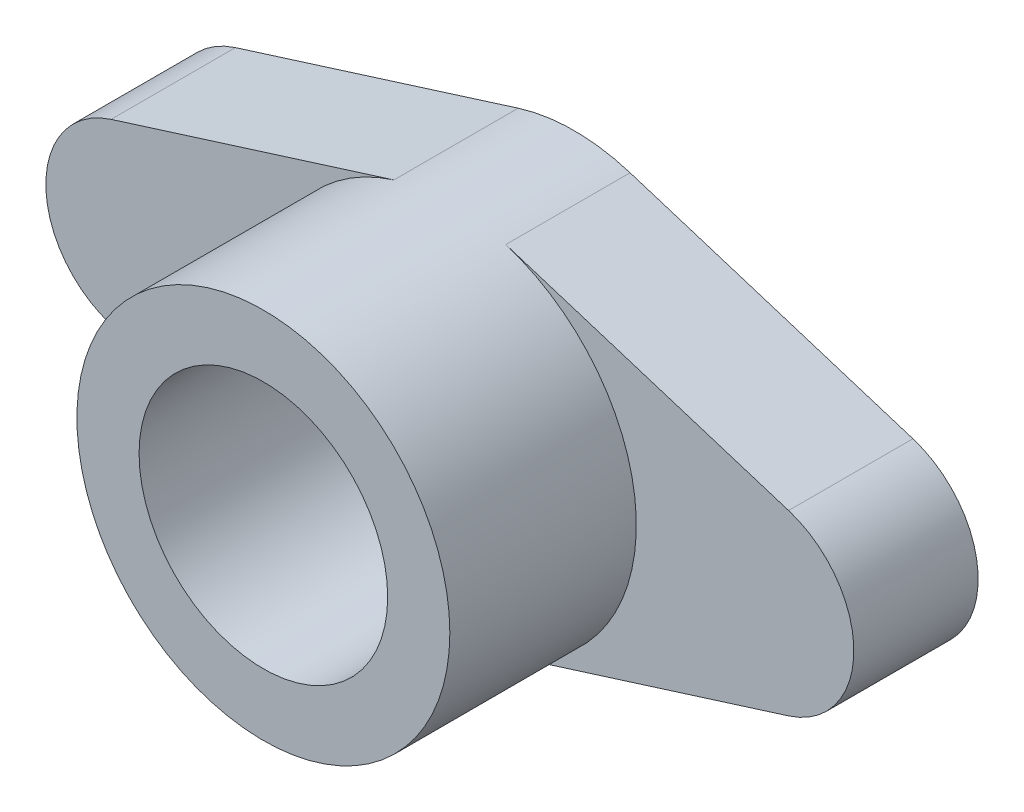
ISO-10303-21;
HEADER;
FILE_DESCRIPTION(('STEP AP214'),'2;1');
FILE_NAME('part.step','',(''),(''),'','','');
FILE_SCHEMA(('AUTOMOTIVE_DESIGN { 1 0 10303 214 1 1 1 1 }'));
ENDSEC;
DATA;
#1=APPLICATION_CONTEXT('core data for automotive mechanical design processes');
#2=APPLICATION_PROTOCOL_DEFINITION('international standard','automotive_design',2000,#1);
#3=PRODUCT_CONTEXT('',#1,'mechanical');
#4=PRODUCT('Part','Part','',(#3));
#5=PRODUCT_RELATED_PRODUCT_CATEGORY('part','',(#4));
#6=PRODUCT_DEFINITION_FORMATION('','',#4);
#7=PRODUCT_DEFINITION_CONTEXT('part definition',#1,'design');
#8=PRODUCT_DEFINITION('design','',#6,#7);
#9=PRODUCT_DEFINITION_SHAPE('','',#8);
#10=(LENGTH_UNIT() NAMED_UNIT(*) SI_UNIT(.MILLI.,.METRE.));
#11=(NAMED_UNIT(*) PLANE_ANGLE_UNIT() SI_UNIT($,.RADIAN.));
#12=(NAMED_UNIT(*) SI_UNIT($,.STERADIAN.) SOLID_ANGLE_UNIT());
#13=UNCERTAINTY_MEASURE_WITH_UNIT(LENGTH_MEASURE(1.E-05),#10,'distance_accuracy_value','');
#14=(GEOMETRIC_REPRESENTATION_CONTEXT(3) GLOBAL_UNCERTAINTY_ASSIGNED_CONTEXT((#13)) GLOBAL_UNIT_ASSIGNED_CONTEXT((#10,
#11,#12)) REPRESENTATION_CONTEXT('',''));
#15=CARTESIAN_POINT('',(0.,0.,0.));
#16=DIRECTION('',(0.,0.,1.));
#17=DIRECTION('',(1.,0.,0.));
#18=AXIS2_PLACEMENT_3D('',#15,#16,#17);
#19=CARTESIAN_POINT('',(50.,0.,20.));
#20=DIRECTION('',(0.,0.,1.));
#21=DIRECTION('',(1.,0.,0.));
#22=AXIS2_PLACEMENT_3D('',#19,#20,#21);
#23=PLANE('',#22);
#24=CARTESIAN_POINT('',(0.,0.,20.));
#25=DIRECTION('',(0.,0.,1.));
#26=DIRECTION('',(1.,0.,0.));
#27=AXIS2_PLACEMENT_3D('',#24,#25,#26);
#28=CIRCLE('',#27,30.);
#29=CARTESIAN_POINT('',(-9.,28.6181760425084,20.));
#30=VERTEX_POINT('',#29);
#31=CARTESIAN_POINT('',(-9.,-28.6181760425084,20.));
#32=VERTEX_POINT('',#31);
#33=EDGE_CURVE('E13',#30,#32,#28,.T.);
#34=ORIENTED_EDGE('',*,*,#33,.F.);
#35=DIRECTION('',(-0.953939201416946,-0.3,0.));
#36=VECTOR('',#35,1.);
#37=CARTESIAN_POINT('',(-9.,28.6181760425084,20.));
#38=LINE('',#37,#36);
#39=CARTESIAN_POINT('',(-54.5,14.3090880212542,20.));
#40=VERTEX_POINT('',#39);
#41=EDGE_CURVE('E151',#30,#40,#38,.T.);
#42=ORIENTED_EDGE('',*,*,#41,.T.);
#43=CARTESIAN_POINT('',(-50.,0.,20.));
#44=DIRECTION('',(0.,0.,1.));
#45=DIRECTION('',(1.,0.,0.));
#46=AXIS2_PLACEMENT_3D('',#43,#44,#45);
#47=CIRCLE('',#46,15.);
#48=CARTESIAN_POINT('',(-54.5,-14.3090880212542,20.));
#49=VERTEX_POINT('',#48);
#50=EDGE_CURVE('E125',#40,#49,#47,.T.);
#51=ORIENTED_EDGE('',*,*,#50,.T.);
#52=DIRECTION('',(0.953939201416946,-0.3,0.));
#53=VECTOR('',#52,1.);
#54=CARTESIAN_POINT('',(-54.5,-14.3090880212542,20.));
#55=LINE('',#54,#53);
#56=EDGE_CURVE('E121',#49,#32,#55,.T.);
#57=ORIENTED_EDGE('',*,*,#56,.T.);
#58=EDGE_LOOP('',(#34,#42,#51,#57));
#59=FACE_BOUND('',#58,.T.);
#60=ADVANCED_FACE('F44',(#59),#23,.T.);
#61=CARTESIAN_POINT('',(8.99999999999999,-28.6181760425084,20.));
#62=VERTEX_POINT('',#61);
#63=CARTESIAN_POINT('',(9.,28.6181760425084,20.));
#64=VERTEX_POINT('',#63);
#65=EDGE_CURVE('E54',#62,#64,#28,.T.);
#66=ORIENTED_EDGE('',*,*,#65,.F.);
#67=DIRECTION('',(0.953939201416946,0.3,0.));
#68=VECTOR('',#67,1.);
#69=CARTESIAN_POINT('',(8.99999999999998,-28.6181760425083,20.));
#70=LINE('',#69,#68);
#71=CARTESIAN_POINT('',(54.5,-14.3090880212542,20.));
#72=VERTEX_POINT('',#71);
#73=EDGE_CURVE('E63',#62,#72,#70,.T.);
#74=ORIENTED_EDGE('',*,*,#73,.T.);
#75=CARTESIAN_POINT('',(50.,0.,20.));
#76=DIRECTION('',(0.,0.,1.));
#77=DIRECTION('',(1.,0.,0.));
#78=AXIS2_PLACEMENT_3D('',#75,#76,#77);
#79=CIRCLE('',#78,15.);
#80=CARTESIAN_POINT('',(54.5,14.3090880212542,20.));
#81=VERTEX_POINT('',#80);
#82=EDGE_CURVE('E156',#72,#81,#79,.T.);
#83=ORIENTED_EDGE('',*,*,#82,.T.);
#84=DIRECTION('',(-0.953939201416946,0.3,0.));
#85=VECTOR('',#84,1.);
#86=CARTESIAN_POINT('',(9.,28.6181760425084,20.));
#87=LINE('',#86,#85);
#88=EDGE_CURVE('E108',#81,#64,#87,.T.);
#89=ORIENTED_EDGE('',*,*,#88,.T.);
#90=EDGE_LOOP('',(#66,#74,#83,#89));
#91=FACE_BOUND('',#90,.T.);
#92=ADVANCED_FACE('F187',(#91),#23,.T.);
#93=CARTESIAN_POINT('',(50.,0.,0.));
#94=DIRECTION('',(0.,0.,1.));
#95=DIRECTION('',(1.,0.,0.));
#96=AXIS2_PLACEMENT_3D('',#93,#94,#95);
#97=PLANE('',#96);
#98=CARTESIAN_POINT('',(50.,0.,0.));
#99=DIRECTION('',(0.,0.,1.));
#100=DIRECTION('',(1.,0.,0.));
#101=AXIS2_PLACEMENT_3D('',#98,#99,#100);
#102=CIRCLE('',#101,15.);
#103=CARTESIAN_POINT('',(54.5,-14.3090880212542,0.));
#104=VERTEX_POINT('',#103);
#105=CARTESIAN_POINT('',(54.5,14.3090880212542,0.));
#106=VERTEX_POINT('',#105);
#107=EDGE_CURVE('E162',#104,#106,#102,.T.);
#108=ORIENTED_EDGE('',*,*,#107,.F.);
#109=DIRECTION('',(0.953939201416946,0.3,0.));
#110=VECTOR('',#109,1.);
#111=CARTESIAN_POINT('',(8.99999999999998,-28.6181760425083,0.));
#112=LINE('',#111,#110);
#113=CARTESIAN_POINT('',(8.99999999999999,-28.6181760425084,0.));
#114=VERTEX_POINT('',#113);
#115=EDGE_CURVE('E99',#114,#104,#112,.T.);
#116=ORIENTED_EDGE('',*,*,#115,.F.);
#117=CARTESIAN_POINT('',(0.,0.,0.));
#118=DIRECTION('',(0.,0.,1.));
#119=DIRECTION('',(1.,0.,0.));
#120=AXIS2_PLACEMENT_3D('',#117,#118,#119);
#121=CIRCLE('',#120,30.);
#122=CARTESIAN_POINT('',(-9.,-28.6181760425084,0.));
#123=VERTEX_POINT('',#122);
#124=EDGE_CURVE('E93',#123,#114,#121,.T.);
#125=ORIENTED_EDGE('',*,*,#124,.F.);
#126=DIRECTION('',(0.953939201416946,-0.3,0.));
#127=VECTOR('',#126,1.);
#128=CARTESIAN_POINT('',(-54.5,-14.3090880212542,0.));
#129=LINE('',#128,#127);
#130=CARTESIAN_POINT('',(-54.5,-14.3090880212542,0.));
#131=VERTEX_POINT('',#130);
#132=EDGE_CURVE('E133',#131,#123,#129,.T.);
#133=ORIENTED_EDGE('',*,*,#132,.F.);
#134=CARTESIAN_POINT('',(-50.,0.,0.));
#135=DIRECTION('',(0.,0.,1.));
#136=DIRECTION('',(1.,0.,0.));
#137=AXIS2_PLACEMENT_3D('',#134,#135,#136);
#138=CIRCLE('',#137,15.);
#139=CARTESIAN_POINT('',(-54.5,14.3090880212542,0.));
#140=VERTEX_POINT('',#139);
#141=EDGE_CURVE('E171',#140,#131,#138,.T.);
#142=ORIENTED_EDGE('',*,*,#141,.F.);
#143=DIRECTION('',(-0.953939201416946,-0.3,0.));
#144=VECTOR('',#143,1.);
#145=CARTESIAN_POINT('',(-9.,28.6181760425084,0.));
#146=LINE('',#145,#144);
#147=CARTESIAN_POINT('',(-9.,28.6181760425084,0.));
#148=VERTEX_POINT('',#147);
#149=EDGE_CURVE('E169',#148,#140,#146,.T.);
#150=ORIENTED_EDGE('',*,*,#149,.F.);
#151=CARTESIAN_POINT('',(0.,0.,0.));
#152=DIRECTION('',(0.,0.,1.));
#153=DIRECTION('',(1.,0.,0.));
#154=AXIS2_PLACEMENT_3D('',#151,#152,#153);
#155=CIRCLE('',#154,30.);
#156=CARTESIAN_POINT('',(9.,28.6181760425084,0.));
#157=VERTEX_POINT('',#156);
#158=EDGE_CURVE('E144',#157,#148,#155,.T.);
#159=ORIENTED_EDGE('',*,*,#158,.F.);
#160=DIRECTION('',(-0.953939201416946,0.3,0.));
#161=VECTOR('',#160,1.);
#162=CARTESIAN_POINT('',(9.,28.6181760425084,0.));
#163=LINE('',#162,#161);
#164=EDGE_CURVE('E165',#106,#157,#163,.T.);
#165=ORIENTED_EDGE('',*,*,#164,.F.);
#166=EDGE_LOOP('',(#108,#116,#125,#133,#142,#150,#159,#165));
#167=FACE_BOUND('',#166,.T.);
#168=CARTESIAN_POINT('',(0.,0.,0.));
#169=DIRECTION('',(0.,0.,1.));
#170=DIRECTION('',(1.,0.,0.));
#171=AXIS2_PLACEMENT_3D('',#168,#169,#170);
#172=CIRCLE('',#171,20.);
#173=CARTESIAN_POINT('',(20.,0.,0.));
#174=VERTEX_POINT('',#173);
#175=EDGE_CURVE('E166',#174,#174,#172,.T.);
#176=ORIENTED_EDGE('',*,*,#175,.T.);
#177=EDGE_LOOP('',(#176));
#178=FACE_BOUND('',#177,.T.);
#179=ADVANCED_FACE('F191',(#167,#178),#97,.F.);
#180=CARTESIAN_POINT('',(50.,0.,20.));
#181=DIRECTION('',(0.,0.,-1.));
#182=DIRECTION('',(-1.,0.,0.));
#183=AXIS2_PLACEMENT_3D('',#180,#181,#182);
#184=CYLINDRICAL_SURFACE('',#183,15.);
#185=ORIENTED_EDGE('',*,*,#107,.T.);
#186=DIRECTION('',(0.,0.,-1.));
#187=VECTOR('',#186,1.);
#188=CARTESIAN_POINT('',(54.5,14.3090880212542,20.));
#189=LINE('',#188,#187);
#190=EDGE_CURVE('E48',#81,#106,#189,.T.);
#191=ORIENTED_EDGE('',*,*,#190,.F.);
#192=ORIENTED_EDGE('',*,*,#82,.F.);
#193=DIRECTION('',(0.,0.,-1.));
#194=VECTOR('',#193,1.);
#195=CARTESIAN_POINT('',(54.5,-14.3090880212542,20.));
#196=LINE('',#195,#194);
#197=EDGE_CURVE('E161',#72,#104,#196,.T.);
#198=ORIENTED_EDGE('',*,*,#197,.T.);
#199=EDGE_LOOP('',(#185,#191,#192,#198));
#200=FACE_BOUND('',#199,.T.);
#201=ADVANCED_FACE('F46',(#200),#184,.T.);
#202=CARTESIAN_POINT('',(9.,28.6181760425084,20.));
#203=DIRECTION('',(-0.3,-0.953939201416946,0.));
#204=DIRECTION('',(0.953939201416946,-0.3,0.));
#205=AXIS2_PLACEMENT_3D('',#202,#203,#204);
#206=PLANE('',#205);
#207=ORIENTED_EDGE('',*,*,#164,.T.);
#208=DIRECTION('',(0.,0.,-1.));
#209=VECTOR('',#208,1.);
#210=CARTESIAN_POINT('',(9.,28.6181760425084,20.));
#211=LINE('',#210,#209);
#212=EDGE_CURVE('E147',#64,#157,#211,.T.);
#213=ORIENTED_EDGE('',*,*,#212,.F.);
#214=ORIENTED_EDGE('',*,*,#88,.F.);
#215=ORIENTED_EDGE('',*,*,#190,.T.);
#216=EDGE_LOOP('',(#207,#213,#214,#215));
#217=FACE_BOUND('',#216,.T.);
#218=ADVANCED_FACE('F193',(#217),#206,.F.);
#219=CARTESIAN_POINT('',(-9.,28.6181760425084,20.));
#220=DIRECTION('',(0.3,-0.953939201416946,0.));
#221=DIRECTION('',(0.953939201416946,0.3,0.));
#222=AXIS2_PLACEMENT_3D('',#219,#220,#221);
#223=PLANE('',#222);
#224=ORIENTED_EDGE('',*,*,#149,.T.);
#225=DIRECTION('',(0.,0.,-1.));
#226=VECTOR('',#225,1.);
#227=CARTESIAN_POINT('',(-54.5,14.3090880212542,20.));
#228=LINE('',#227,#226);
#229=EDGE_CURVE('E148',#40,#140,#228,.T.);
#230=ORIENTED_EDGE('',*,*,#229,.F.);
#231=ORIENTED_EDGE('',*,*,#41,.F.);
#232=DIRECTION('',(0.,0.,-1.));
#233=VECTOR('',#232,1.);
#234=CARTESIAN_POINT('',(-9.,28.6181760425084,20.));
#235=LINE('',#234,#233);
#236=EDGE_CURVE('E140',#30,#148,#235,.T.);
#237=ORIENTED_EDGE('',*,*,#236,.T.);
#238=EDGE_LOOP('',(#224,#230,#231,#237));
#239=FACE_BOUND('',#238,.T.);
#240=ADVANCED_FACE('F152',(#239),#223,.F.);
#241=CARTESIAN_POINT('',(-50.,0.,20.));
#242=DIRECTION('',(0.,0.,-1.));
#243=DIRECTION('',(-1.,0.,0.));
#244=AXIS2_PLACEMENT_3D('',#241,#242,#243);
#245=CYLINDRICAL_SURFACE('',#244,15.);
#246=ORIENTED_EDGE('',*,*,#141,.T.);
#247=DIRECTION('',(0.,0.,-1.));
#248=VECTOR('',#247,1.);
#249=CARTESIAN_POINT('',(-54.5,-14.3090880212542,20.));
#250=LINE('',#249,#248);
#251=EDGE_CURVE('E134',#49,#131,#250,.T.);
#252=ORIENTED_EDGE('',*,*,#251,.F.);
#253=ORIENTED_EDGE('',*,*,#50,.F.);
#254=ORIENTED_EDGE('',*,*,#229,.T.);
#255=EDGE_LOOP('',(#246,#252,#253,#254));
#256=FACE_BOUND('',#255,.T.);
#257=ADVANCED_FACE('F199',(#256),#245,.T.);
#258=CARTESIAN_POINT('',(-54.5,-14.3090880212542,20.));
#259=DIRECTION('',(0.3,0.953939201416946,0.));
#260=DIRECTION('',(-0.953939201416946,0.3,0.));
#261=AXIS2_PLACEMENT_3D('',#258,#259,#260);
#262=PLANE('',#261);
#263=ORIENTED_EDGE('',*,*,#132,.T.);
#264=DIRECTION('',(0.,0.,-1.));
#265=VECTOR('',#264,1.);
#266=CARTESIAN_POINT('',(-9.,-28.6181760425084,20.));
#267=LINE('',#266,#265);
#268=EDGE_CURVE('E130',#32,#123,#267,.T.);
#269=ORIENTED_EDGE('',*,*,#268,.F.);
#270=ORIENTED_EDGE('',*,*,#56,.F.);
#271=ORIENTED_EDGE('',*,*,#251,.T.);
#272=EDGE_LOOP('',(#263,#269,#270,#271));
#273=FACE_BOUND('',#272,.T.);
#274=ADVANCED_FACE('F131',(#273),#262,.F.);
#275=CARTESIAN_POINT('',(0.,0.,20.));
#276=DIRECTION('',(0.,0.,-1.));
#277=DIRECTION('',(-1.,0.,0.));
#278=AXIS2_PLACEMENT_3D('',#275,#276,#277);
#279=CYLINDRICAL_SURFACE('',#278,30.);
#280=ORIENTED_EDGE('',*,*,#124,.T.);
#281=DIRECTION('',(0.,0.,-1.));
#282=VECTOR('',#281,1.);
#283=CARTESIAN_POINT('',(8.99999999999999,-28.6181760425084,20.));
#284=LINE('',#283,#282);
#285=EDGE_CURVE('E135',#62,#114,#284,.T.);
#286=ORIENTED_EDGE('',*,*,#285,.F.);
#287=ORIENTED_EDGE('',*,*,#65,.T.);
#288=ORIENTED_EDGE('',*,*,#212,.T.);
#289=ORIENTED_EDGE('',*,*,#158,.T.);
#290=ORIENTED_EDGE('',*,*,#236,.F.);
#291=ORIENTED_EDGE('',*,*,#33,.T.);
#292=ORIENTED_EDGE('',*,*,#268,.T.);
#293=EDGE_LOOP('',(#280,#286,#287,#288,#289,#290,#291,#292));
#294=FACE_BOUND('',#293,.T.);
#295=CARTESIAN_POINT('',(0.,0.,50.));
#296=DIRECTION('',(0.,0.,1.));
#297=DIRECTION('',(1.,0.,0.));
#298=AXIS2_PLACEMENT_3D('',#295,#296,#297);
#299=CIRCLE('',#298,30.);
#300=CARTESIAN_POINT('',(30.,0.,50.));
#301=VERTEX_POINT('',#300);
#302=EDGE_CURVE('E183',#301,#301,#299,.T.);
#303=ORIENTED_EDGE('',*,*,#302,.F.);
#304=EDGE_LOOP('',(#303));
#305=FACE_BOUND('',#304,.T.);
#306=ADVANCED_FACE('F137',(#294,#305),#279,.T.);
#307=CARTESIAN_POINT('',(8.99999999999998,-28.6181760425083,20.));
#308=DIRECTION('',(-0.3,0.953939201416946,0.));
#309=DIRECTION('',(-0.953939201416946,-0.3,0.));
#310=AXIS2_PLACEMENT_3D('',#307,#308,#309);
#311=PLANE('',#310);
#312=ORIENTED_EDGE('',*,*,#115,.T.);
#313=ORIENTED_EDGE('',*,*,#197,.F.);
#314=ORIENTED_EDGE('',*,*,#73,.F.);
#315=ORIENTED_EDGE('',*,*,#285,.T.);
#316=EDGE_LOOP('',(#312,#313,#314,#315));
#317=FACE_BOUND('',#316,.T.);
#318=ADVANCED_FACE('F212',(#317),#311,.F.);
#319=CARTESIAN_POINT('',(0.,0.,20.));
#320=DIRECTION('',(0.,0.,-1.));
#321=DIRECTION('',(-1.,0.,0.));
#322=AXIS2_PLACEMENT_3D('',#319,#320,#321);
#323=CYLINDRICAL_SURFACE('',#322,20.);
#324=ORIENTED_EDGE('',*,*,#175,.F.);
#325=EDGE_LOOP('',(#324));
#326=FACE_BOUND('',#325,.T.);
#327=CARTESIAN_POINT('',(0.,0.,50.));
#328=DIRECTION('',(0.,0.,1.));
#329=DIRECTION('',(1.,0.,0.));
#330=AXIS2_PLACEMENT_3D('',#327,#328,#329);
#331=CIRCLE('',#330,20.);
#332=CARTESIAN_POINT('',(20.,0.,50.));
#333=VERTEX_POINT('',#332);
#334=EDGE_CURVE('E309',#333,#333,#331,.T.);
#335=ORIENTED_EDGE('',*,*,#334,.T.);
#336=EDGE_LOOP('',(#335));
#337=FACE_BOUND('',#336,.T.);
#338=ADVANCED_FACE('F208',(#326,#337),#323,.F.);
#339=CARTESIAN_POINT('',(0.,0.,50.));
#340=DIRECTION('',(0.,0.,1.));
#341=DIRECTION('',(1.,0.,0.));
#342=AXIS2_PLACEMENT_3D('',#339,#340,#341);
#343=PLANE('',#342);
#344=ORIENTED_EDGE('',*,*,#302,.T.);
#345=EDGE_LOOP('',(#344));
#346=FACE_BOUND('',#345,.T.);
#347=ORIENTED_EDGE('',*,*,#334,.F.);
#348=EDGE_LOOP('',(#347));
#349=FACE_BOUND('',#348,.T.);
#350=ADVANCED_FACE('F244',(#346,#349),#343,.T.);
#351=CLOSED_SHELL('',(#60,#92,#179,#201,#218,#240,#257,#274,#306,#318,#338,#350));
#352=MANIFOLD_SOLID_BREP('B2',#351);
#353=ADVANCED_BREP_SHAPE_REPRESENTATION('',(#18,#352),#14);
#354=SHAPE_DEFINITION_REPRESENTATION(#9,#353);
ENDSEC;
END-ISO-10303-21;
